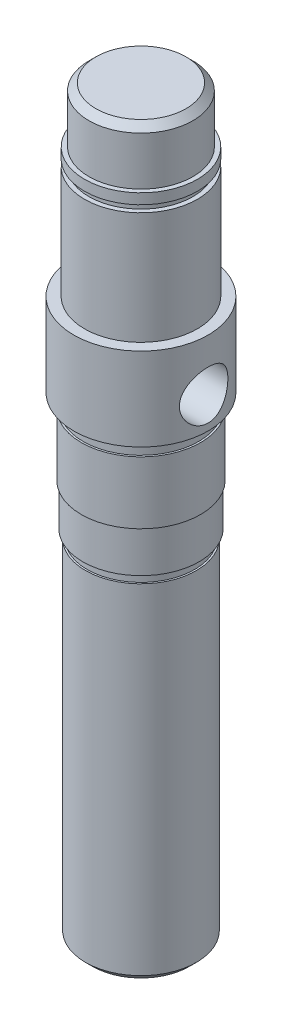
ISO-10303-21;
HEADER;
FILE_DESCRIPTION(('STEP AP214'),'2;1');
FILE_NAME('part.step','',(''),(''),'','','');
FILE_SCHEMA(('AUTOMOTIVE_DESIGN { 1 0 10303 214 1 1 1 1 }'));
ENDSEC;
DATA;
#1=APPLICATION_CONTEXT('core data for automotive mechanical design processes');
#2=APPLICATION_PROTOCOL_DEFINITION('international standard','automotive_design',2000,#1);
#3=PRODUCT_CONTEXT('',#1,'mechanical');
#4=PRODUCT('Part','Part','',(#3));
#5=PRODUCT_RELATED_PRODUCT_CATEGORY('part','',(#4));
#6=PRODUCT_DEFINITION_FORMATION('','',#4);
#7=PRODUCT_DEFINITION_CONTEXT('part definition',#1,'design');
#8=PRODUCT_DEFINITION('design','',#6,#7);
#9=PRODUCT_DEFINITION_SHAPE('','',#8);
#10=(LENGTH_UNIT() NAMED_UNIT(*) SI_UNIT(.MILLI.,.METRE.));
#11=(NAMED_UNIT(*) PLANE_ANGLE_UNIT() SI_UNIT($,.RADIAN.));
#12=(NAMED_UNIT(*) SI_UNIT($,.STERADIAN.) SOLID_ANGLE_UNIT());
#13=UNCERTAINTY_MEASURE_WITH_UNIT(LENGTH_MEASURE(1.E-05),#10,'distance_accuracy_value','');
#14=(GEOMETRIC_REPRESENTATION_CONTEXT(3) GLOBAL_UNCERTAINTY_ASSIGNED_CONTEXT((#13)) GLOBAL_UNIT_ASSIGNED_CONTEXT((#10,
#11,#12)) REPRESENTATION_CONTEXT('',''));
#15=CARTESIAN_POINT('',(0.,0.,0.));
#16=DIRECTION('',(0.,0.,1.));
#17=DIRECTION('',(1.,0.,0.));
#18=AXIS2_PLACEMENT_3D('',#15,#16,#17);
#19=CARTESIAN_POINT('',(0.,107.,0.));
#20=DIRECTION('',(0.,1.,0.));
#21=DIRECTION('',(0.,0.,1.));
#22=AXIS2_PLACEMENT_3D('',#19,#20,#21);
#23=CYLINDRICAL_SURFACE('',#22,9.7);
#24=CARTESIAN_POINT('',(0.,68.3,0.));
#25=DIRECTION('',(0.,1.,0.));
#26=DIRECTION('',(0.,0.,1.));
#27=AXIS2_PLACEMENT_3D('',#24,#25,#26);
#28=CIRCLE('',#27,9.7);
#29=CARTESIAN_POINT('',(0.,68.3,9.7));
#30=VERTEX_POINT('',#29);
#31=EDGE_CURVE('E126',#30,#30,#28,.T.);
#32=ORIENTED_EDGE('',*,*,#31,.T.);
#33=EDGE_LOOP('',(#32));
#34=FACE_BOUND('',#33,.T.);
#35=CARTESIAN_POINT('',(0.,80.3,0.));
#36=DIRECTION('',(0.,1.,0.));
#37=DIRECTION('',(0.,0.,1.));
#38=AXIS2_PLACEMENT_3D('',#35,#36,#37);
#39=CIRCLE('',#38,9.7);
#40=CARTESIAN_POINT('',(0.,80.3,9.7));
#41=VERTEX_POINT('',#40);
#42=EDGE_CURVE('E123',#41,#41,#39,.T.);
#43=ORIENTED_EDGE('',*,*,#42,.F.);
#44=EDGE_LOOP('',(#43));
#45=FACE_BOUND('',#44,.T.);
#46=CARTESIAN_POINT('',(9.7,76.3,0.));
#47=CARTESIAN_POINT('',(9.70000326363208,76.3000044955306,-0.190048434312413));
#48=CARTESIAN_POINT('',(9.69436502310496,76.2844715213943,-0.380065060738042));
#49=CARTESIAN_POINT('',(9.67243340114104,76.2229796151586,-0.754447520469261));
#50=CARTESIAN_POINT('',(9.6561406602026,76.1770225120126,-0.938813692756118));
#51=CARTESIAN_POINT('',(9.61465656297397,76.056500360991,-1.29644341601968));
#52=CARTESIAN_POINT('',(9.58948158703399,75.9819879522946,-1.46972671546527));
#53=CARTESIAN_POINT('',(9.53276201569288,75.8067276163716,-1.80132810228594));
#54=CARTESIAN_POINT('',(9.50121585549874,75.7059732422301,-1.95964249917633));
#55=CARTESIAN_POINT('',(9.43363084003839,75.4768963511195,-2.26310684130997));
#56=CARTESIAN_POINT('',(9.39747147835585,75.347715125354,-2.40758151312234));
#57=CARTESIAN_POINT('',(9.32535229272255,75.0672750043416,-2.67335049376495));
#58=CARTESIAN_POINT('',(9.2893925260619,74.9160100793378,-2.79463845071457));
#59=CARTESIAN_POINT('',(9.22036932494171,74.589282473392,-3.01472760920259));
#60=CARTESIAN_POINT('',(9.18744978930663,74.4131620197553,-3.11260192105112));
#61=CARTESIAN_POINT('',(9.13009434964343,74.0455830371819,-3.27704413538523));
#62=CARTESIAN_POINT('',(9.10565534320794,73.8541301488788,-3.3436234895813));
#63=CARTESIAN_POINT('',(9.06930945422295,73.4690659544289,-3.44096614767453));
#64=CARTESIAN_POINT('',(9.05695599489681,73.2758220280291,-3.47301058915794));
#65=CARTESIAN_POINT('',(9.04486769860813,72.8863354900277,-3.50437996520875));
#66=CARTESIAN_POINT('',(9.04512813440671,72.6900940293584,-3.50371715728725));
#67=CARTESIAN_POINT('',(9.05785091249404,72.3116123435047,-3.47067569177911));
#68=CARTESIAN_POINT('',(9.06964442029104,72.1291937963775,-3.44003546231126));
#69=CARTESIAN_POINT('',(9.10299899622594,71.7722866266259,-3.3507694420784));
#70=CARTESIAN_POINT('',(9.12456142579761,71.5977991130309,-3.2921397505352));
#71=CARTESIAN_POINT('',(9.17545236904553,71.2580223962428,-3.14754158601287));
#72=CARTESIAN_POINT('',(9.20491367715409,71.0929552769824,-3.06110004294575));
#73=CARTESIAN_POINT('',(9.26823458396981,70.7791489752728,-2.86366099099152));
#74=CARTESIAN_POINT('',(9.30209561736307,70.6304151481907,-2.75265546381061));
#75=CARTESIAN_POINT('',(9.37295773274056,70.3438211342941,-2.50114692866622));
#76=CARTESIAN_POINT('',(9.41002348969878,70.2072025711136,-2.35924408032947));
#77=CARTESIAN_POINT('',(9.48130712611506,69.9593480232088,-2.05410244545163));
#78=CARTESIAN_POINT('',(9.51552463005577,69.8481153820406,-1.8908608528525));
#79=CARTESIAN_POINT('',(9.57784962624326,69.6529549876507,-1.54469787396443));
#80=CARTESIAN_POINT('',(9.60586933384917,69.5694120859784,-1.36154259916851));
#81=CARTESIAN_POINT('',(9.65199610066544,69.4347270107282,-0.982517762074592));
#82=CARTESIAN_POINT('',(9.67010722221703,69.383571557527,-0.786653447150329));
#83=CARTESIAN_POINT('',(9.69367649897002,69.3174340921615,-0.398241992693978));
#84=CARTESIAN_POINT('',(9.69971962647188,69.3007781665351,-0.206015067332783));
#85=CARTESIAN_POINT('',(9.70026094381358,69.2992756819393,0.178558142724519));
#86=CARTESIAN_POINT('',(9.69476147121017,69.314422682381,0.370904395368631));
#87=CARTESIAN_POINT('',(9.67322206396606,69.374803917233,0.743211618243393));
#88=CARTESIAN_POINT('',(9.65755795448175,69.4189660526467,0.923370432152372));
#89=CARTESIAN_POINT('',(9.6176399859743,69.5347375623733,1.27361485837229));
#90=CARTESIAN_POINT('',(9.59338501042671,69.6063505044701,1.44369915797884));
#91=CARTESIAN_POINT('',(9.53784534991105,69.7772213099272,1.77438230731065));
#92=CARTESIAN_POINT('',(9.50638018857487,69.8772081797726,1.93457324534963));
#93=CARTESIAN_POINT('',(9.43993371175233,70.1011541230601,2.23642059530887));
#94=CARTESIAN_POINT('',(9.40495117244505,70.2251215541498,2.37807051641664));
#95=CARTESIAN_POINT('',(9.33301253255255,70.501344890552,2.64674498418307));
#96=CARTESIAN_POINT('',(9.29605117578761,70.6547611009922,2.77257826584955));
#97=CARTESIAN_POINT('',(9.22617619324352,70.9812880031909,2.99691853154221));
#98=CARTESIAN_POINT('',(9.19326279613658,71.1543998065053,3.09542397219298));
#99=CARTESIAN_POINT('',(9.13542619130016,71.5162931309494,3.26218250914122));
#100=CARTESIAN_POINT('',(9.11051622041164,71.7050999676196,3.33038555899287));
#101=CARTESIAN_POINT('',(9.07211527346371,72.0926547206841,3.43363039976507));
#102=CARTESIAN_POINT('',(9.05861793659507,72.2913970340502,3.46869066403966));
#103=CARTESIAN_POINT('',(9.04537391578975,72.680382531402,3.50307251896356));
#104=CARTESIAN_POINT('',(9.04485315408342,72.8704231827226,3.50440605027261));
#105=CARTESIAN_POINT('',(9.05566130946437,73.2478661626803,3.47638016301811));
#106=CARTESIAN_POINT('',(9.06698926615892,73.4352687039005,3.44702323205678));
#107=CARTESIAN_POINT('',(9.09959684074913,73.7971741890099,3.35996972486521));
#108=CARTESIAN_POINT('',(9.12060861050414,73.9718862678548,3.3030339253056));
#109=CARTESIAN_POINT('',(9.1700792819177,74.3093939457707,3.16308828400569));
#110=CARTESIAN_POINT('',(9.19853999491781,74.4721866340935,3.08007209937613));
#111=CARTESIAN_POINT('',(9.26145596420581,74.7899862946857,2.88554358646493));
#112=CARTESIAN_POINT('',(9.29613822299486,74.9442089274945,2.77282405541366));
#113=CARTESIAN_POINT('',(9.36675222929969,75.2321957811959,2.52401650801083));
#114=CARTESIAN_POINT('',(9.40268435591504,75.3659537273147,2.38792135139043));
#115=CARTESIAN_POINT('',(9.47384591335729,75.6158145326139,2.08831076460616));
#116=CARTESIAN_POINT('',(9.5089564254182,75.7307441726914,1.92378450733773));
#117=CARTESIAN_POINT('',(9.57265097937597,75.9312473439185,1.57653817122));
#118=CARTESIAN_POINT('',(9.60123531746125,76.0168222074143,1.39381891859498));
#119=CARTESIAN_POINT('',(9.64889832770736,76.1564301569307,1.01291303744514));
#120=CARTESIAN_POINT('',(9.66785793269195,76.2100695080788,0.814566153396514));
#121=CARTESIAN_POINT('',(9.69340446232499,76.2818447031419,0.410798501658297));
#122=CARTESIAN_POINT('',(9.69999647307293,76.2999951417905,0.205380677258914));
#123=CARTESIAN_POINT('',(9.7,76.3,0.));
#124=B_SPLINE_CURVE_WITH_KNOTS('',3,(#46,#47,#48,#49,#50,#51,#52,#53,#54,#55,#56,#57,#58,#59,
#60,#61,#62,#63,#64,#65,#66,#67,#68,#69,#70,#71,#72,#73,#74,#75,#76,#77,#78,#79,#80,#81,#82,#83,
#84,#85,#86,#87,#88,#89,#90,#91,#92,#93,#94,#95,#96,#97,#98,#99,#100,#101,#102,#103,#104,#105,
#106,#107,#108,#109,#110,#111,#112,#113,#114,#115,#116,#117,#118,#119,#120,#121,#122,#123),
.UNSPECIFIED.,.T.,.F.,(4,2,2,2,2,2,2,2,2,2,2,2,2,2,2,2,2,2,2,2,2,2,2,2,2,2,2,2,2,2,2,2,2,2,2,2,
2,2,4),(0.,0.569388345410459,1.13874246502282,1.70705204038071,2.27550136537242,
2.86432632019842,3.45331235015006,4.06274682276192,4.67195811210805,5.25769676297937,
5.8432159015532,6.39667789415568,6.95021704304686,7.51371919542262,8.07740556093055,
8.67595822456505,9.27458967757422,9.88122288759437,10.4876072022281,11.063806383537,
11.639888886775,12.1957994262361,12.7517822419501,13.3235939071889,13.8956052190755,
14.4982838272857,15.1009964656292,15.704700857624,16.3080685539524,16.8753520908334,
17.4425896503562,17.995001162535,18.5475471282925,19.1274455926038,19.7075215075113,
20.315774937114,20.9240007558306,21.539577970193,22.1549019765539),.UNSPECIFIED.);
#125=CARTESIAN_POINT('',(9.7,76.3,0.));
#126=VERTEX_POINT('',#125);
#127=EDGE_CURVE('E166',#126,#126,#124,.T.);
#128=ORIENTED_EDGE('',*,*,#127,.T.);
#129=EDGE_LOOP('',(#128));
#130=FACE_BOUND('',#129,.T.);
#131=ADVANCED_FACE('F42',(#34,#45,#130),#23,.T.);
#132=CARTESIAN_POINT('',(0.,0.,0.));
#133=DIRECTION('',(0.,-1.,0.));
#134=DIRECTION('',(0.,0.,-1.));
#135=AXIS2_PLACEMENT_3D('',#132,#133,#134);
#136=PLANE('',#135);
#137=CARTESIAN_POINT('',(0.,0.,0.));
#138=DIRECTION('',(0.,-1.,0.));
#139=DIRECTION('',(0.,0.,-1.));
#140=AXIS2_PLACEMENT_3D('',#137,#138,#139);
#141=CIRCLE('',#140,4.49999999999999);
#142=CARTESIAN_POINT('',(0.,0.,-4.49999999999999));
#143=VERTEX_POINT('',#142);
#144=EDGE_CURVE('E11',#143,#143,#141,.F.);
#145=ORIENTED_EDGE('',*,*,#144,.T.);
#146=EDGE_LOOP('',(#145));
#147=FACE_BOUND('',#146,.T.);
#148=CARTESIAN_POINT('',(0.,0.,0.));
#149=DIRECTION('',(0.,1.,0.));
#150=DIRECTION('',(0.,0.,1.));
#151=AXIS2_PLACEMENT_3D('',#148,#149,#150);
#152=CIRCLE('',#151,7.);
#153=CARTESIAN_POINT('',(0.,0.,7.));
#154=VERTEX_POINT('',#153);
#155=EDGE_CURVE('E159',#154,#154,#152,.T.);
#156=ORIENTED_EDGE('',*,*,#155,.F.);
#157=EDGE_LOOP('',(#156));
#158=FACE_BOUND('',#157,.T.);
#159=ADVANCED_FACE('F238',(#147,#158),#136,.T.);
#160=CARTESIAN_POINT('',(0.,1.,0.));
#161=DIRECTION('',(0.,1.,0.));
#162=DIRECTION('',(0.,0.,1.));
#163=AXIS2_PLACEMENT_3D('',#160,#161,#162);
#164=CONICAL_SURFACE('',#163,8.00000000000003,0.78539816339746);
#165=ORIENTED_EDGE('',*,*,#155,.T.);
#166=EDGE_LOOP('',(#165));
#167=FACE_BOUND('',#166,.T.);
#168=CARTESIAN_POINT('',(0.,1.,0.));
#169=DIRECTION('',(0.,1.,0.));
#170=DIRECTION('',(0.,0.,1.));
#171=AXIS2_PLACEMENT_3D('',#168,#169,#170);
#172=CIRCLE('',#171,8.00000000000003);
#173=CARTESIAN_POINT('',(0.,1.,8.00000000000003));
#174=VERTEX_POINT('',#173);
#175=EDGE_CURVE('E156',#174,#174,#172,.T.);
#176=ORIENTED_EDGE('',*,*,#175,.F.);
#177=EDGE_LOOP('',(#176));
#178=FACE_BOUND('',#177,.T.);
#179=ADVANCED_FACE('F243',(#167,#178),#164,.T.);
#180=CARTESIAN_POINT('',(0.,107.,0.));
#181=DIRECTION('',(0.,1.,0.));
#182=DIRECTION('',(0.,0.,1.));
#183=AXIS2_PLACEMENT_3D('',#180,#181,#182);
#184=CYLINDRICAL_SURFACE('',#183,8.00000000000003);
#185=CARTESIAN_POINT('',(0.,2.69999999999999,0.));
#186=DIRECTION('',(0.,-1.,0.));
#187=DIRECTION('',(0.,0.,-1.));
#188=AXIS2_PLACEMENT_3D('',#185,#186,#187);
#189=CIRCLE('',#188,8.00000000000003);
#190=CARTESIAN_POINT('',(5.80947501931,2.7,-5.5));
#191=VERTEX_POINT('',#190);
#192=CARTESIAN_POINT('',(-5.80947501931116,2.70000000000001,-5.5));
#193=VERTEX_POINT('',#192);
#194=EDGE_CURVE('E164',#191,#193,#189,.F.);
#195=ORIENTED_EDGE('',*,*,#194,.F.);
#196=DIRECTION('',(0.,1.,0.));
#197=VECTOR('',#196,1.);
#198=CARTESIAN_POINT('',(5.80947501931,2.7,-5.5));
#199=LINE('',#198,#197);
#200=CARTESIAN_POINT('',(5.80947501931,47.1,-5.5));
#201=VERTEX_POINT('',#200);
#202=EDGE_CURVE('E85',#191,#201,#199,.T.);
#203=ORIENTED_EDGE('',*,*,#202,.T.);
#204=CARTESIAN_POINT('',(0.,47.1,0.));
#205=DIRECTION('',(0.,1.,0.));
#206=DIRECTION('',(0.,0.,1.));
#207=AXIS2_PLACEMENT_3D('',#204,#205,#206);
#208=CIRCLE('',#207,8.00000000000003);
#209=CARTESIAN_POINT('',(-5.80947501931,47.1,-5.5));
#210=VERTEX_POINT('',#209);
#211=EDGE_CURVE('E162',#210,#201,#208,.F.);
#212=ORIENTED_EDGE('',*,*,#211,.F.);
#213=DIRECTION('',(0.,-1.,0.));
#214=VECTOR('',#213,1.);
#215=CARTESIAN_POINT('',(-5.80947501931,47.1,-5.5));
#216=LINE('',#215,#214);
#217=EDGE_CURVE('E93',#210,#193,#216,.T.);
#218=ORIENTED_EDGE('',*,*,#217,.T.);
#219=EDGE_LOOP('',(#195,#203,#212,#218));
#220=FACE_BOUND('',#219,.T.);
#221=ORIENTED_EDGE('',*,*,#175,.T.);
#222=EDGE_LOOP('',(#221));
#223=FACE_BOUND('',#222,.T.);
#224=CARTESIAN_POINT('',(0.,50.,0.));
#225=DIRECTION('',(0.,1.,0.));
#226=DIRECTION('',(0.,0.,1.));
#227=AXIS2_PLACEMENT_3D('',#224,#225,#226);
#228=CIRCLE('',#227,8.00000000000003);
#229=CARTESIAN_POINT('',(0.,50.,8.00000000000003));
#230=VERTEX_POINT('',#229);
#231=EDGE_CURVE('E153',#230,#230,#228,.T.);
#232=ORIENTED_EDGE('',*,*,#231,.F.);
#233=EDGE_LOOP('',(#232));
#234=FACE_BOUND('',#233,.T.);
#235=ADVANCED_FACE('F254',(#220,#223,#234),#184,.T.);
#236=CARTESIAN_POINT('',(-8.00000000000003,50.,0.));
#237=DIRECTION('',(0.,1.,0.));
#238=DIRECTION('',(0.,0.,1.));
#239=AXIS2_PLACEMENT_3D('',#236,#237,#238);
#240=PLANE('',#239);
#241=ORIENTED_EDGE('',*,*,#231,.T.);
#242=EDGE_LOOP('',(#241));
#243=FACE_BOUND('',#242,.T.);
#244=CARTESIAN_POINT('',(0.,50.,0.));
#245=DIRECTION('',(0.,1.,0.));
#246=DIRECTION('',(0.,0.,1.));
#247=AXIS2_PLACEMENT_3D('',#244,#245,#246);
#248=CIRCLE('',#247,7.75000000000003);
#249=CARTESIAN_POINT('',(0.,50.,7.75000000000003));
#250=VERTEX_POINT('',#249);
#251=EDGE_CURVE('E150',#250,#250,#248,.T.);
#252=ORIENTED_EDGE('',*,*,#251,.F.);
#253=EDGE_LOOP('',(#252));
#254=FACE_BOUND('',#253,.T.);
#255=ADVANCED_FACE('F261',(#243,#254),#240,.T.);
#256=CARTESIAN_POINT('',(0.,107.,0.));
#257=DIRECTION('',(0.,1.,0.));
#258=DIRECTION('',(0.,0.,1.));
#259=AXIS2_PLACEMENT_3D('',#256,#257,#258);
#260=CYLINDRICAL_SURFACE('',#259,7.75000000000003);
#261=ORIENTED_EDGE('',*,*,#251,.T.);
#262=EDGE_LOOP('',(#261));
#263=FACE_BOUND('',#262,.T.);
#264=CARTESIAN_POINT('',(0.,51.3,0.));
#265=DIRECTION('',(0.,1.,0.));
#266=DIRECTION('',(0.,0.,1.));
#267=AXIS2_PLACEMENT_3D('',#264,#265,#266);
#268=CIRCLE('',#267,7.75000000000003);
#269=CARTESIAN_POINT('',(0.,51.3,7.75000000000003));
#270=VERTEX_POINT('',#269);
#271=EDGE_CURVE('E147',#270,#270,#268,.T.);
#272=ORIENTED_EDGE('',*,*,#271,.F.);
#273=EDGE_LOOP('',(#272));
#274=FACE_BOUND('',#273,.T.);
#275=ADVANCED_FACE('F265',(#263,#274),#260,.T.);
#276=CARTESIAN_POINT('',(-7.75000000000003,51.3,0.));
#277=DIRECTION('',(0.,-1.,0.));
#278=DIRECTION('',(0.,0.,-1.));
#279=AXIS2_PLACEMENT_3D('',#276,#277,#278);
#280=PLANE('',#279);
#281=ORIENTED_EDGE('',*,*,#271,.T.);
#282=EDGE_LOOP('',(#281));
#283=FACE_BOUND('',#282,.T.);
#284=CARTESIAN_POINT('',(0.,51.3,0.));
#285=DIRECTION('',(0.,1.,0.));
#286=DIRECTION('',(0.,0.,1.));
#287=AXIS2_PLACEMENT_3D('',#284,#285,#286);
#288=CIRCLE('',#287,8.40000000000003);
#289=CARTESIAN_POINT('',(0.,51.3,8.40000000000003));
#290=VERTEX_POINT('',#289);
#291=EDGE_CURVE('E144',#290,#290,#288,.T.);
#292=ORIENTED_EDGE('',*,*,#291,.F.);
#293=EDGE_LOOP('',(#292));
#294=FACE_BOUND('',#293,.T.);
#295=ADVANCED_FACE('F269',(#283,#294),#280,.T.);
#296=CARTESIAN_POINT('',(0.,107.,0.));
#297=DIRECTION('',(0.,1.,0.));
#298=DIRECTION('',(0.,0.,1.));
#299=AXIS2_PLACEMENT_3D('',#296,#297,#298);
#300=CYLINDRICAL_SURFACE('',#299,8.40000000000001);
#301=ORIENTED_EDGE('',*,*,#291,.T.);
#302=EDGE_LOOP('',(#301));
#303=FACE_BOUND('',#302,.T.);
#304=CARTESIAN_POINT('',(0.,57.3,0.));
#305=DIRECTION('',(0.,1.,0.));
#306=DIRECTION('',(0.,0.,1.));
#307=AXIS2_PLACEMENT_3D('',#304,#305,#306);
#308=CIRCLE('',#307,8.39999999999999);
#309=CARTESIAN_POINT('',(0.,57.3,8.39999999999999));
#310=VERTEX_POINT('',#309);
#311=EDGE_CURVE('E141',#310,#310,#308,.T.);
#312=ORIENTED_EDGE('',*,*,#311,.F.);
#313=EDGE_LOOP('',(#312));
#314=FACE_BOUND('',#313,.T.);
#315=ADVANCED_FACE('F273',(#303,#314),#300,.T.);
#316=CARTESIAN_POINT('',(-8.39999999999999,57.3,0.));
#317=DIRECTION('',(0.,-1.,0.));
#318=DIRECTION('',(0.,0.,-1.));
#319=AXIS2_PLACEMENT_3D('',#316,#317,#318);
#320=PLANE('',#319);
#321=ORIENTED_EDGE('',*,*,#311,.T.);
#322=EDGE_LOOP('',(#321));
#323=FACE_BOUND('',#322,.T.);
#324=CARTESIAN_POINT('',(0.,57.3,0.));
#325=DIRECTION('',(0.,1.,0.));
#326=DIRECTION('',(0.,0.,1.));
#327=AXIS2_PLACEMENT_3D('',#324,#325,#326);
#328=CIRCLE('',#327,8.59999999999999);
#329=CARTESIAN_POINT('',(0.,57.3,8.59999999999999));
#330=VERTEX_POINT('',#329);
#331=EDGE_CURVE('E138',#330,#330,#328,.T.);
#332=ORIENTED_EDGE('',*,*,#331,.F.);
#333=EDGE_LOOP('',(#332));
#334=FACE_BOUND('',#333,.T.);
#335=ADVANCED_FACE('F277',(#323,#334),#320,.T.);
#336=CARTESIAN_POINT('',(0.,107.,0.));
#337=DIRECTION('',(0.,1.,0.));
#338=DIRECTION('',(0.,0.,1.));
#339=AXIS2_PLACEMENT_3D('',#336,#337,#338);
#340=CYLINDRICAL_SURFACE('',#339,8.59999999999999);
#341=ORIENTED_EDGE('',*,*,#331,.T.);
#342=EDGE_LOOP('',(#341));
#343=FACE_BOUND('',#342,.T.);
#344=CARTESIAN_POINT('',(0.,66.3,0.));
#345=DIRECTION('',(0.,1.,0.));
#346=DIRECTION('',(0.,0.,1.));
#347=AXIS2_PLACEMENT_3D('',#344,#345,#346);
#348=CIRCLE('',#347,8.59999999999999);
#349=CARTESIAN_POINT('',(0.,66.3,8.59999999999999));
#350=VERTEX_POINT('',#349);
#351=EDGE_CURVE('E135',#350,#350,#348,.T.);
#352=ORIENTED_EDGE('',*,*,#351,.F.);
#353=EDGE_LOOP('',(#352));
#354=FACE_BOUND('',#353,.T.);
#355=ADVANCED_FACE('F281',(#343,#354),#340,.T.);
#356=CARTESIAN_POINT('',(-8.59999999999999,66.3,0.));
#357=DIRECTION('',(0.,1.,0.));
#358=DIRECTION('',(0.,0.,1.));
#359=AXIS2_PLACEMENT_3D('',#356,#357,#358);
#360=PLANE('',#359);
#361=ORIENTED_EDGE('',*,*,#351,.T.);
#362=EDGE_LOOP('',(#361));
#363=FACE_BOUND('',#362,.T.);
#364=CARTESIAN_POINT('',(0.,66.3,0.));
#365=DIRECTION('',(0.,1.,0.));
#366=DIRECTION('',(0.,0.,1.));
#367=AXIS2_PLACEMENT_3D('',#364,#365,#366);
#368=CIRCLE('',#367,8.32999999999999);
#369=CARTESIAN_POINT('',(0.,66.3,8.32999999999999));
#370=VERTEX_POINT('',#369);
#371=EDGE_CURVE('E132',#370,#370,#368,.T.);
#372=ORIENTED_EDGE('',*,*,#371,.F.);
#373=EDGE_LOOP('',(#372));
#374=FACE_BOUND('',#373,.T.);
#375=ADVANCED_FACE('F285',(#363,#374),#360,.T.);
#376=CARTESIAN_POINT('',(0.,107.,0.));
#377=DIRECTION('',(0.,1.,0.));
#378=DIRECTION('',(0.,0.,1.));
#379=AXIS2_PLACEMENT_3D('',#376,#377,#378);
#380=CYLINDRICAL_SURFACE('',#379,8.32999999999999);
#381=ORIENTED_EDGE('',*,*,#371,.T.);
#382=EDGE_LOOP('',(#381));
#383=FACE_BOUND('',#382,.T.);
#384=CARTESIAN_POINT('',(0.,68.3,0.));
#385=DIRECTION('',(0.,1.,0.));
#386=DIRECTION('',(0.,0.,1.));
#387=AXIS2_PLACEMENT_3D('',#384,#385,#386);
#388=CIRCLE('',#387,8.32999999999999);
#389=CARTESIAN_POINT('',(0.,68.3,8.32999999999999));
#390=VERTEX_POINT('',#389);
#391=EDGE_CURVE('E129',#390,#390,#388,.T.);
#392=ORIENTED_EDGE('',*,*,#391,.F.);
#393=EDGE_LOOP('',(#392));
#394=FACE_BOUND('',#393,.T.);
#395=ADVANCED_FACE('F234',(#383,#394),#380,.T.);
#396=CARTESIAN_POINT('',(-8.32999999999999,68.3,0.));
#397=DIRECTION('',(0.,-1.,0.));
#398=DIRECTION('',(0.,0.,-1.));
#399=AXIS2_PLACEMENT_3D('',#396,#397,#398);
#400=PLANE('',#399);
#401=ORIENTED_EDGE('',*,*,#391,.T.);
#402=EDGE_LOOP('',(#401));
#403=FACE_BOUND('',#402,.T.);
#404=ORIENTED_EDGE('',*,*,#31,.F.);
#405=EDGE_LOOP('',(#404));
#406=FACE_BOUND('',#405,.T.);
#407=ADVANCED_FACE('F229',(#403,#406),#400,.T.);
#408=CARTESIAN_POINT('',(-9.7,80.3,0.));
#409=DIRECTION('',(0.,1.,0.));
#410=DIRECTION('',(0.,0.,1.));
#411=AXIS2_PLACEMENT_3D('',#408,#409,#410);
#412=PLANE('',#411);
#413=ORIENTED_EDGE('',*,*,#42,.T.);
#414=EDGE_LOOP('',(#413));
#415=FACE_BOUND('',#414,.T.);
#416=CARTESIAN_POINT('',(0.,80.3,0.));
#417=DIRECTION('',(0.,1.,0.));
#418=DIRECTION('',(0.,0.,1.));
#419=AXIS2_PLACEMENT_3D('',#416,#417,#418);
#420=CIRCLE('',#419,8.15);
#421=CARTESIAN_POINT('',(0.,80.3,8.15));
#422=VERTEX_POINT('',#421);
#423=EDGE_CURVE('E120',#422,#422,#420,.T.);
#424=ORIENTED_EDGE('',*,*,#423,.F.);
#425=EDGE_LOOP('',(#424));
#426=FACE_BOUND('',#425,.T.);
#427=ADVANCED_FACE('F226',(#415,#426),#412,.T.);
#428=CARTESIAN_POINT('',(0.,107.,0.));
#429=DIRECTION('',(0.,1.,0.));
#430=DIRECTION('',(0.,0.,1.));
#431=AXIS2_PLACEMENT_3D('',#428,#429,#430);
#432=CYLINDRICAL_SURFACE('',#431,8.15);
#433=ORIENTED_EDGE('',*,*,#423,.T.);
#434=EDGE_LOOP('',(#433));
#435=FACE_BOUND('',#434,.T.);
#436=CARTESIAN_POINT('',(0.,96.5,0.));
#437=DIRECTION('',(0.,1.,0.));
#438=DIRECTION('',(0.,0.,1.));
#439=AXIS2_PLACEMENT_3D('',#436,#437,#438);
#440=CIRCLE('',#439,8.15);
#441=CARTESIAN_POINT('',(0.,96.5,8.15));
#442=VERTEX_POINT('',#441);
#443=EDGE_CURVE('E117',#442,#442,#440,.T.);
#444=ORIENTED_EDGE('',*,*,#443,.F.);
#445=EDGE_LOOP('',(#444));
#446=FACE_BOUND('',#445,.T.);
#447=ADVANCED_FACE('F223',(#435,#446),#432,.T.);
#448=CARTESIAN_POINT('',(-8.15,96.5,0.));
#449=DIRECTION('',(0.,1.,0.));
#450=DIRECTION('',(0.,0.,1.));
#451=AXIS2_PLACEMENT_3D('',#448,#449,#450);
#452=PLANE('',#451);
#453=ORIENTED_EDGE('',*,*,#443,.T.);
#454=EDGE_LOOP('',(#453));
#455=FACE_BOUND('',#454,.T.);
#456=CARTESIAN_POINT('',(0.,96.5,0.));
#457=DIRECTION('',(0.,1.,0.));
#458=DIRECTION('',(0.,0.,1.));
#459=AXIS2_PLACEMENT_3D('',#456,#457,#458);
#460=CIRCLE('',#459,7.5);
#461=CARTESIAN_POINT('',(0.,96.5,7.5));
#462=VERTEX_POINT('',#461);
#463=EDGE_CURVE('E114',#462,#462,#460,.T.);
#464=ORIENTED_EDGE('',*,*,#463,.F.);
#465=EDGE_LOOP('',(#464));
#466=FACE_BOUND('',#465,.T.);
#467=ADVANCED_FACE('F219',(#455,#466),#452,.T.);
#468=CARTESIAN_POINT('',(0.,107.,0.));
#469=DIRECTION('',(0.,1.,0.));
#470=DIRECTION('',(0.,0.,1.));
#471=AXIS2_PLACEMENT_3D('',#468,#469,#470);
#472=CYLINDRICAL_SURFACE('',#471,7.5);
#473=ORIENTED_EDGE('',*,*,#463,.T.);
#474=EDGE_LOOP('',(#473));
#475=FACE_BOUND('',#474,.T.);
#476=CARTESIAN_POINT('',(0.,97.5,0.));
#477=DIRECTION('',(0.,1.,0.));
#478=DIRECTION('',(0.,0.,1.));
#479=AXIS2_PLACEMENT_3D('',#476,#477,#478);
#480=CIRCLE('',#479,7.5);
#481=CARTESIAN_POINT('',(0.,97.5,7.5));
#482=VERTEX_POINT('',#481);
#483=EDGE_CURVE('E111',#482,#482,#480,.T.);
#484=ORIENTED_EDGE('',*,*,#483,.F.);
#485=EDGE_LOOP('',(#484));
#486=FACE_BOUND('',#485,.T.);
#487=ADVANCED_FACE('F215',(#475,#486),#472,.T.);
#488=CARTESIAN_POINT('',(-7.5,97.5,0.));
#489=DIRECTION('',(0.,-1.,0.));
#490=DIRECTION('',(0.,0.,-1.));
#491=AXIS2_PLACEMENT_3D('',#488,#489,#490);
#492=PLANE('',#491);
#493=ORIENTED_EDGE('',*,*,#483,.T.);
#494=EDGE_LOOP('',(#493));
#495=FACE_BOUND('',#494,.T.);
#496=CARTESIAN_POINT('',(0.,97.5,0.));
#497=DIRECTION('',(0.,1.,0.));
#498=DIRECTION('',(0.,0.,1.));
#499=AXIS2_PLACEMENT_3D('',#496,#497,#498);
#500=CIRCLE('',#499,8.15);
#501=CARTESIAN_POINT('',(0.,97.5,8.15));
#502=VERTEX_POINT('',#501);
#503=EDGE_CURVE('E108',#502,#502,#500,.T.);
#504=ORIENTED_EDGE('',*,*,#503,.F.);
#505=EDGE_LOOP('',(#504));
#506=FACE_BOUND('',#505,.T.);
#507=ADVANCED_FACE('F211',(#495,#506),#492,.T.);
#508=CARTESIAN_POINT('',(0.,107.,0.));
#509=DIRECTION('',(0.,1.,0.));
#510=DIRECTION('',(0.,0.,1.));
#511=AXIS2_PLACEMENT_3D('',#508,#509,#510);
#512=CYLINDRICAL_SURFACE('',#511,8.15);
#513=ORIENTED_EDGE('',*,*,#503,.T.);
#514=EDGE_LOOP('',(#513));
#515=FACE_BOUND('',#514,.T.);
#516=CARTESIAN_POINT('',(0.,99.,0.));
#517=DIRECTION('',(0.,1.,0.));
#518=DIRECTION('',(0.,0.,1.));
#519=AXIS2_PLACEMENT_3D('',#516,#517,#518);
#520=CIRCLE('',#519,8.15);
#521=CARTESIAN_POINT('',(0.,99.,8.15));
#522=VERTEX_POINT('',#521);
#523=EDGE_CURVE('E105',#522,#522,#520,.T.);
#524=ORIENTED_EDGE('',*,*,#523,.F.);
#525=EDGE_LOOP('',(#524));
#526=FACE_BOUND('',#525,.T.);
#527=ADVANCED_FACE('F207',(#515,#526),#512,.T.);
#528=CARTESIAN_POINT('',(-8.15,99.,0.));
#529=DIRECTION('',(0.,1.,0.));
#530=DIRECTION('',(0.,0.,1.));
#531=AXIS2_PLACEMENT_3D('',#528,#529,#530);
#532=PLANE('',#531);
#533=ORIENTED_EDGE('',*,*,#523,.T.);
#534=EDGE_LOOP('',(#533));
#535=FACE_BOUND('',#534,.T.);
#536=CARTESIAN_POINT('',(0.,99.,0.));
#537=DIRECTION('',(0.,1.,0.));
#538=DIRECTION('',(0.,0.,1.));
#539=AXIS2_PLACEMENT_3D('',#536,#537,#538);
#540=CIRCLE('',#539,7.5);
#541=CARTESIAN_POINT('',(0.,99.,7.5));
#542=VERTEX_POINT('',#541);
#543=EDGE_CURVE('E102',#542,#542,#540,.T.);
#544=ORIENTED_EDGE('',*,*,#543,.F.);
#545=EDGE_LOOP('',(#544));
#546=FACE_BOUND('',#545,.T.);
#547=ADVANCED_FACE('F203',(#535,#546),#532,.T.);
#548=CARTESIAN_POINT('',(0.,107.,0.));
#549=DIRECTION('',(0.,1.,0.));
#550=DIRECTION('',(0.,0.,1.));
#551=AXIS2_PLACEMENT_3D('',#548,#549,#550);
#552=CYLINDRICAL_SURFACE('',#551,7.5);
#553=ORIENTED_EDGE('',*,*,#543,.T.);
#554=EDGE_LOOP('',(#553));
#555=FACE_BOUND('',#554,.T.);
#556=CARTESIAN_POINT('',(0.,106.,0.));
#557=DIRECTION('',(0.,1.,0.));
#558=DIRECTION('',(0.,0.,1.));
#559=AXIS2_PLACEMENT_3D('',#556,#557,#558);
#560=CIRCLE('',#559,7.5);
#561=CARTESIAN_POINT('',(0.,106.,7.5));
#562=VERTEX_POINT('',#561);
#563=EDGE_CURVE('E99',#562,#562,#560,.T.);
#564=ORIENTED_EDGE('',*,*,#563,.F.);
#565=EDGE_LOOP('',(#564));
#566=FACE_BOUND('',#565,.T.);
#567=ADVANCED_FACE('F199',(#555,#566),#552,.T.);
#568=CARTESIAN_POINT('',(0.,107.,0.));
#569=DIRECTION('',(0.,-1.,0.));
#570=DIRECTION('',(0.,0.,-1.));
#571=AXIS2_PLACEMENT_3D('',#568,#569,#570);
#572=CONICAL_SURFACE('',#571,6.5,0.785398163397447);
#573=ORIENTED_EDGE('',*,*,#563,.T.);
#574=EDGE_LOOP('',(#573));
#575=FACE_BOUND('',#574,.T.);
#576=CARTESIAN_POINT('',(0.,107.,0.));
#577=DIRECTION('',(0.,1.,0.));
#578=DIRECTION('',(0.,0.,1.));
#579=AXIS2_PLACEMENT_3D('',#576,#577,#578);
#580=CIRCLE('',#579,6.5);
#581=CARTESIAN_POINT('',(0.,107.,6.5));
#582=VERTEX_POINT('',#581);
#583=EDGE_CURVE('E96',#582,#582,#580,.T.);
#584=ORIENTED_EDGE('',*,*,#583,.F.);
#585=EDGE_LOOP('',(#584));
#586=FACE_BOUND('',#585,.T.);
#587=ADVANCED_FACE('F195',(#575,#586),#572,.T.);
#588=CARTESIAN_POINT('',(-6.5,107.,0.));
#589=DIRECTION('',(0.,1.,0.));
#590=DIRECTION('',(0.,0.,1.));
#591=AXIS2_PLACEMENT_3D('',#588,#589,#590);
#592=PLANE('',#591);
#593=ORIENTED_EDGE('',*,*,#583,.T.);
#594=EDGE_LOOP('',(#593));
#595=FACE_BOUND('',#594,.T.);
#596=ADVANCED_FACE('F191',(#595),#592,.T.);
#597=CARTESIAN_POINT('',(-5.80947501931,2.7,-9.7));
#598=DIRECTION('',(0.,-1.,0.));
#599=DIRECTION('',(0.,0.,-1.));
#600=AXIS2_PLACEMENT_3D('',#597,#598,#599);
#601=PLANE('',#600);
#602=ORIENTED_EDGE('',*,*,#194,.T.);
#603=DIRECTION('',(1.,0.,0.));
#604=VECTOR('',#603,1.);
#605=CARTESIAN_POINT('',(-5.80947501931,2.7,-5.5));
#606=LINE('',#605,#604);
#607=EDGE_CURVE('E65',#193,#191,#606,.T.);
#608=ORIENTED_EDGE('',*,*,#607,.T.);
#609=EDGE_LOOP('',(#602,#608));
#610=FACE_BOUND('',#609,.T.);
#611=ADVANCED_FACE('F187',(#610),#601,.F.);
#612=CARTESIAN_POINT('',(5.80947501931,47.1,-9.7));
#613=DIRECTION('',(0.,1.,0.));
#614=DIRECTION('',(0.,0.,1.));
#615=AXIS2_PLACEMENT_3D('',#612,#613,#614);
#616=PLANE('',#615);
#617=ORIENTED_EDGE('',*,*,#211,.T.);
#618=DIRECTION('',(-1.,0.,0.));
#619=VECTOR('',#618,1.);
#620=CARTESIAN_POINT('',(5.80947501931,47.1,-5.5));
#621=LINE('',#620,#619);
#622=EDGE_CURVE('E91',#201,#210,#621,.T.);
#623=ORIENTED_EDGE('',*,*,#622,.T.);
#624=EDGE_LOOP('',(#617,#623));
#625=FACE_BOUND('',#624,.T.);
#626=ADVANCED_FACE('F184',(#625),#616,.F.);
#627=CARTESIAN_POINT('',(0.,0.,-5.5));
#628=DIRECTION('',(0.,0.,1.));
#629=DIRECTION('',(1.,0.,0.));
#630=AXIS2_PLACEMENT_3D('',#627,#628,#629);
#631=PLANE('',#630);
#632=ORIENTED_EDGE('',*,*,#607,.F.);
#633=ORIENTED_EDGE('',*,*,#217,.F.);
#634=ORIENTED_EDGE('',*,*,#622,.F.);
#635=ORIENTED_EDGE('',*,*,#202,.F.);
#636=EDGE_LOOP('',(#632,#633,#634,#635));
#637=FACE_BOUND('',#636,.T.);
#638=ADVANCED_FACE('F180',(#637),#631,.F.);
#639=CARTESIAN_POINT('',(9.7,72.8,0.));
#640=DIRECTION('',(-1.,0.,0.));
#641=DIRECTION('',(0.,0.,1.));
#642=AXIS2_PLACEMENT_3D('',#639,#640,#641);
#643=CYLINDRICAL_SURFACE('',#642,3.5);
#644=CARTESIAN_POINT('',(0.,72.8,0.));
#645=DIRECTION('',(-0.707106781186547,-0.707106781186547,0.));
#646=DIRECTION('',(-0.707106781186547,0.707106781186547,0.));
#647=AXIS2_PLACEMENT_3D('',#644,#645,#646);
#648=ELLIPSE('',#647,4.94974746830583,3.5);
#649=CARTESIAN_POINT('',(0.,72.8,3.5));
#650=VERTEX_POINT('',#649);
#651=CARTESIAN_POINT('',(0.,72.8,-3.5));
#652=VERTEX_POINT('',#651);
#653=EDGE_CURVE('E57',#650,#652,#648,.F.);
#654=ORIENTED_EDGE('',*,*,#653,.F.);
#655=CARTESIAN_POINT('',(0.,72.8,0.));
#656=DIRECTION('',(-0.707106781186547,0.707106781186547,0.));
#657=DIRECTION('',(-0.707106781186547,-0.707106781186547,0.));
#658=AXIS2_PLACEMENT_3D('',#655,#656,#657);
#659=ELLIPSE('',#658,4.94974746830583,3.5);
#660=EDGE_CURVE('E76',#652,#650,#659,.F.);
#661=ORIENTED_EDGE('',*,*,#660,.F.);
#662=EDGE_LOOP('',(#654,#661));
#663=FACE_BOUND('',#662,.T.);
#664=ORIENTED_EDGE('',*,*,#127,.F.);
#665=EDGE_LOOP('',(#664));
#666=FACE_BOUND('',#665,.T.);
#667=ADVANCED_FACE('F82',(#663,#666),#643,.F.);
#668=CARTESIAN_POINT('',(0.,78.,0.));
#669=DIRECTION('',(0.,-1.,0.));
#670=DIRECTION('',(0.,0.,-1.));
#671=AXIS2_PLACEMENT_3D('',#668,#669,#670);
#672=CYLINDRICAL_SURFACE('',#671,3.5);
#673=CARTESIAN_POINT('',(0.,0.999999999999987,0.));
#674=DIRECTION('',(0.,-1.,0.));
#675=DIRECTION('',(0.,0.,-1.));
#676=AXIS2_PLACEMENT_3D('',#673,#674,#675);
#677=CIRCLE('',#676,3.5);
#678=CARTESIAN_POINT('',(0.,0.999999999999987,-3.5));
#679=VERTEX_POINT('',#678);
#680=EDGE_CURVE('E51',#679,#679,#677,.T.);
#681=ORIENTED_EDGE('',*,*,#680,.T.);
#682=EDGE_LOOP('',(#681));
#683=FACE_BOUND('',#682,.T.);
#684=ORIENTED_EDGE('',*,*,#653,.T.);
#685=ORIENTED_EDGE('',*,*,#660,.T.);
#686=EDGE_LOOP('',(#684,#685));
#687=FACE_BOUND('',#686,.T.);
#688=CARTESIAN_POINT('',(0.,78.,0.));
#689=DIRECTION('',(0.,-1.,0.));
#690=DIRECTION('',(0.,0.,-1.));
#691=AXIS2_PLACEMENT_3D('',#688,#689,#690);
#692=CIRCLE('',#691,3.5);
#693=CARTESIAN_POINT('',(0.,78.,-3.5));
#694=VERTEX_POINT('',#693);
#695=EDGE_CURVE('E80',#694,#694,#692,.T.);
#696=ORIENTED_EDGE('',*,*,#695,.F.);
#697=EDGE_LOOP('',(#696));
#698=FACE_BOUND('',#697,.T.);
#699=ADVANCED_FACE('F77',(#683,#687,#698),#672,.F.);
#700=CARTESIAN_POINT('',(0.,78.,0.));
#701=DIRECTION('',(0.,-1.,0.));
#702=DIRECTION('',(0.,0.,-1.));
#703=AXIS2_PLACEMENT_3D('',#700,#701,#702);
#704=PLANE('',#703);
#705=ORIENTED_EDGE('',*,*,#695,.T.);
#706=EDGE_LOOP('',(#705));
#707=FACE_BOUND('',#706,.T.);
#708=ADVANCED_FACE('F422',(#707),#704,.T.);
#709=CARTESIAN_POINT('',(0.,0.999999999999987,0.));
#710=DIRECTION('',(0.,-1.,0.));
#711=DIRECTION('',(0.,0.,-1.));
#712=AXIS2_PLACEMENT_3D('',#709,#710,#711);
#713=CONICAL_SURFACE('',#712,3.5,0.78539816339745);
#714=ORIENTED_EDGE('',*,*,#144,.F.);
#715=EDGE_LOOP('',(#714));
#716=FACE_BOUND('',#715,.T.);
#717=ORIENTED_EDGE('',*,*,#680,.F.);
#718=EDGE_LOOP('',(#717));
#719=FACE_BOUND('',#718,.T.);
#720=ADVANCED_FACE('F45',(#716,#719),#713,.F.);
#721=CLOSED_SHELL('',(#131,#159,#179,#235,#255,#275,#295,#315,#335,#355,#375,#395,#407,#427,
#447,#467,#487,#507,#527,#547,#567,#587,#596,#611,#626,#638,#667,#699,#708,#720));
#722=MANIFOLD_SOLID_BREP('B2',#721);
#723=ADVANCED_BREP_SHAPE_REPRESENTATION('',(#18,#722),#14);
#724=SHAPE_DEFINITION_REPRESENTATION(#9,#723);
ENDSEC;
END-ISO-10303-21;
